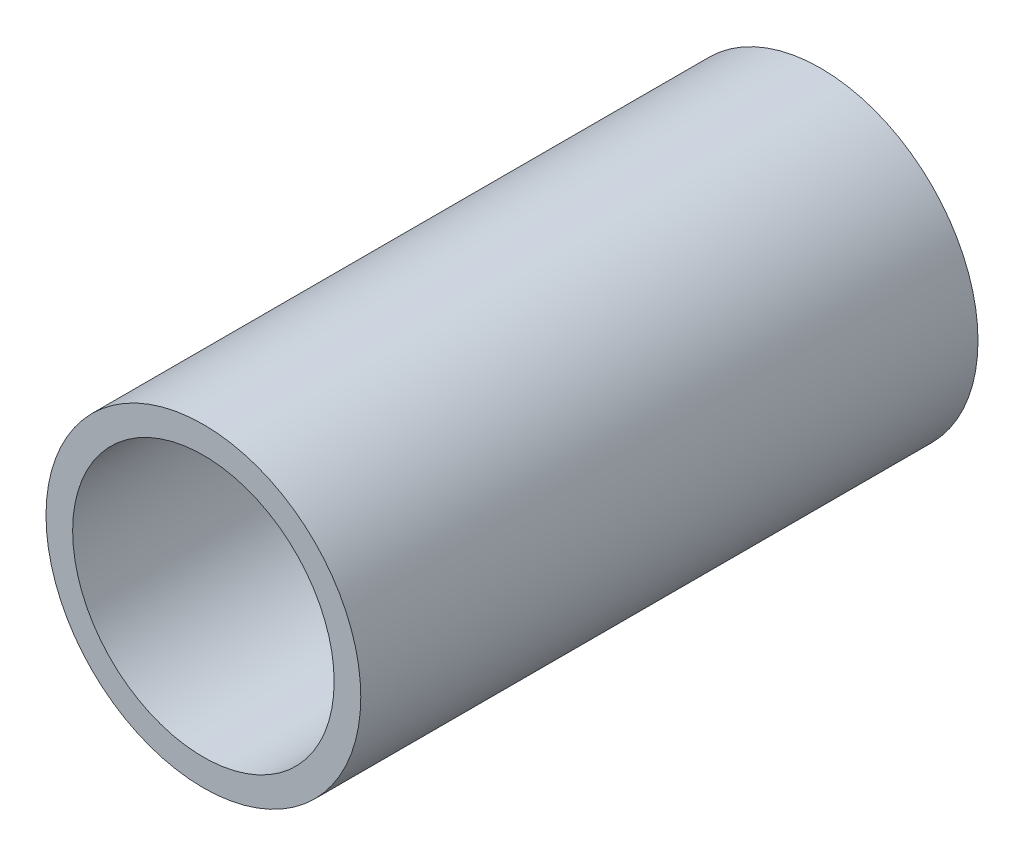
ISO-10303-21;
HEADER;
FILE_DESCRIPTION(('STEP AP214'),'2;1');
FILE_NAME('part.step','',(''),(''),'','','');
FILE_SCHEMA(('AUTOMOTIVE_DESIGN { 1 0 10303 214 1 1 1 1 }'));
ENDSEC;
DATA;
#1=APPLICATION_CONTEXT('core data for automotive mechanical design processes');
#2=APPLICATION_PROTOCOL_DEFINITION('international standard','automotive_design',2000,#1);
#3=PRODUCT_CONTEXT('',#1,'mechanical');
#4=PRODUCT('Part','Part','',(#3));
#5=PRODUCT_RELATED_PRODUCT_CATEGORY('part','',(#4));
#6=PRODUCT_DEFINITION_FORMATION('','',#4);
#7=PRODUCT_DEFINITION_CONTEXT('part definition',#1,'design');
#8=PRODUCT_DEFINITION('design','',#6,#7);
#9=PRODUCT_DEFINITION_SHAPE('','',#8);
#10=(LENGTH_UNIT() NAMED_UNIT(*) SI_UNIT(.MILLI.,.METRE.));
#11=(NAMED_UNIT(*) PLANE_ANGLE_UNIT() SI_UNIT($,.RADIAN.));
#12=(NAMED_UNIT(*) SI_UNIT($,.STERADIAN.) SOLID_ANGLE_UNIT());
#13=UNCERTAINTY_MEASURE_WITH_UNIT(LENGTH_MEASURE(1.E-05),#10,'distance_accuracy_value','');
#14=(GEOMETRIC_REPRESENTATION_CONTEXT(3) GLOBAL_UNCERTAINTY_ASSIGNED_CONTEXT((#13)) GLOBAL_UNIT_ASSIGNED_CONTEXT((#10,
#11,#12)) REPRESENTATION_CONTEXT('',''));
#15=CARTESIAN_POINT('',(0.,0.,0.));
#16=DIRECTION('',(0.,0.,1.));
#17=DIRECTION('',(1.,0.,0.));
#18=AXIS2_PLACEMENT_3D('',#15,#16,#17);
#19=CARTESIAN_POINT('',(0.,0.,49.02));
#20=DIRECTION('',(0.,0.,-1.));
#21=DIRECTION('',(-1.,0.,0.));
#22=AXIS2_PLACEMENT_3D('',#19,#20,#21);
#23=CYLINDRICAL_SURFACE('',#22,12.5);
#24=CARTESIAN_POINT('',(0.,0.,49.02));
#25=DIRECTION('',(0.,0.,1.));
#26=DIRECTION('',(1.,0.,0.));
#27=AXIS2_PLACEMENT_3D('',#24,#25,#26);
#28=CIRCLE('',#27,12.5);
#29=CARTESIAN_POINT('',(12.5,0.,49.02));
#30=VERTEX_POINT('',#29);
#31=EDGE_CURVE('E10',#30,#30,#28,.T.);
#32=ORIENTED_EDGE('',*,*,#31,.F.);
#33=EDGE_LOOP('',(#32));
#34=FACE_BOUND('',#33,.T.);
#35=CARTESIAN_POINT('',(0.,0.,0.));
#36=DIRECTION('',(0.,0.,1.));
#37=DIRECTION('',(1.,0.,0.));
#38=AXIS2_PLACEMENT_3D('',#35,#36,#37);
#39=CIRCLE('',#38,12.5);
#40=CARTESIAN_POINT('',(12.5,0.,0.));
#41=VERTEX_POINT('',#40);
#42=EDGE_CURVE('E40',#41,#41,#39,.T.);
#43=ORIENTED_EDGE('',*,*,#42,.T.);
#44=EDGE_LOOP('',(#43));
#45=FACE_BOUND('',#44,.T.);
#46=ADVANCED_FACE('F37',(#34,#45),#23,.T.);
#47=CARTESIAN_POINT('',(0.,0.,49.02));
#48=DIRECTION('',(0.,0.,1.));
#49=DIRECTION('',(1.,0.,0.));
#50=AXIS2_PLACEMENT_3D('',#47,#48,#49);
#51=PLANE('',#50);
#52=CARTESIAN_POINT('',(0.,0.,49.02));
#53=DIRECTION('',(0.,0.,-1.));
#54=DIRECTION('',(-1.,0.,0.));
#55=AXIS2_PLACEMENT_3D('',#52,#53,#54);
#56=CIRCLE('',#55,10.385);
#57=CARTESIAN_POINT('',(-10.385,0.,49.02));
#58=VERTEX_POINT('',#57);
#59=EDGE_CURVE('E47',#58,#58,#56,.T.);
#60=ORIENTED_EDGE('',*,*,#59,.T.);
#61=EDGE_LOOP('',(#60));
#62=FACE_BOUND('',#61,.T.);
#63=ORIENTED_EDGE('',*,*,#31,.T.);
#64=EDGE_LOOP('',(#63));
#65=FACE_BOUND('',#64,.T.);
#66=ADVANCED_FACE('F55',(#62,#65),#51,.T.);
#67=CARTESIAN_POINT('',(0.,0.,0.));
#68=DIRECTION('',(0.,0.,1.));
#69=DIRECTION('',(1.,0.,0.));
#70=AXIS2_PLACEMENT_3D('',#67,#68,#69);
#71=PLANE('',#70);
#72=CARTESIAN_POINT('',(0.,0.,0.));
#73=DIRECTION('',(0.,0.,-1.));
#74=DIRECTION('',(-1.,0.,0.));
#75=AXIS2_PLACEMENT_3D('',#72,#73,#74);
#76=CIRCLE('',#75,10.385);
#77=CARTESIAN_POINT('',(-10.385,0.,0.));
#78=VERTEX_POINT('',#77);
#79=EDGE_CURVE('E49',#78,#78,#76,.T.);
#80=ORIENTED_EDGE('',*,*,#79,.F.);
#81=EDGE_LOOP('',(#80));
#82=FACE_BOUND('',#81,.T.);
#83=ORIENTED_EDGE('',*,*,#42,.F.);
#84=EDGE_LOOP('',(#83));
#85=FACE_BOUND('',#84,.T.);
#86=ADVANCED_FACE('F60',(#82,#85),#71,.F.);
#87=CARTESIAN_POINT('',(0.,0.,49.02));
#88=DIRECTION('',(0.,0.,-1.));
#89=DIRECTION('',(-1.,0.,0.));
#90=AXIS2_PLACEMENT_3D('',#87,#88,#89);
#91=CYLINDRICAL_SURFACE('',#90,10.385);
#92=ORIENTED_EDGE('',*,*,#59,.F.);
#93=EDGE_LOOP('',(#92));
#94=FACE_BOUND('',#93,.T.);
#95=ORIENTED_EDGE('',*,*,#79,.T.);
#96=EDGE_LOOP('',(#95));
#97=FACE_BOUND('',#96,.T.);
#98=ADVANCED_FACE('F57',(#94,#97),#91,.F.);
#99=CLOSED_SHELL('',(#46,#66,#86,#98));
#100=MANIFOLD_SOLID_BREP('B2',#99);
#101=ADVANCED_BREP_SHAPE_REPRESENTATION('',(#18,#100),#14);
#102=SHAPE_DEFINITION_REPRESENTATION(#9,#101);
ENDSEC;
END-ISO-10303-21;
